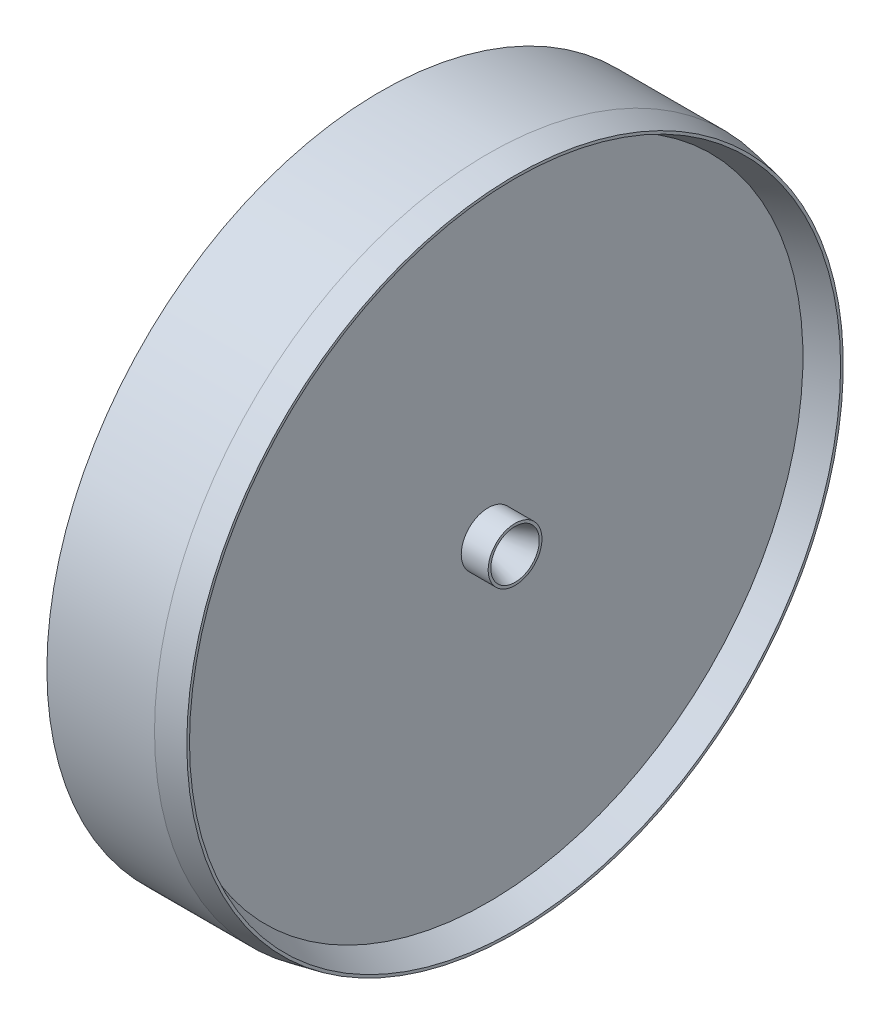
ISO-10303-21;
HEADER;
FILE_DESCRIPTION(('STEP AP214'),'2;1');
FILE_NAME('part.step','',(''),(''),'','','');
FILE_SCHEMA(('AUTOMOTIVE_DESIGN { 1 0 10303 214 1 1 1 1 }'));
ENDSEC;
DATA;
#1=APPLICATION_CONTEXT('core data for automotive mechanical design processes');
#2=APPLICATION_PROTOCOL_DEFINITION('international standard','automotive_design',2000,#1);
#3=PRODUCT_CONTEXT('',#1,'mechanical');
#4=PRODUCT('Part','Part','',(#3));
#5=PRODUCT_RELATED_PRODUCT_CATEGORY('part','',(#4));
#6=PRODUCT_DEFINITION_FORMATION('','',#4);
#7=PRODUCT_DEFINITION_CONTEXT('part definition',#1,'design');
#8=PRODUCT_DEFINITION('design','',#6,#7);
#9=PRODUCT_DEFINITION_SHAPE('','',#8);
#10=(LENGTH_UNIT() NAMED_UNIT(*) SI_UNIT(.MILLI.,.METRE.));
#11=(NAMED_UNIT(*) PLANE_ANGLE_UNIT() SI_UNIT($,.RADIAN.));
#12=(NAMED_UNIT(*) SI_UNIT($,.STERADIAN.) SOLID_ANGLE_UNIT());
#13=UNCERTAINTY_MEASURE_WITH_UNIT(LENGTH_MEASURE(1.E-05),#10,'distance_accuracy_value','');
#14=(GEOMETRIC_REPRESENTATION_CONTEXT(3) GLOBAL_UNCERTAINTY_ASSIGNED_CONTEXT((#13)) GLOBAL_UNIT_ASSIGNED_CONTEXT((#10,
#11,#12)) REPRESENTATION_CONTEXT('',''));
#15=CARTESIAN_POINT('',(0.,0.,0.));
#16=DIRECTION('',(0.,0.,1.));
#17=DIRECTION('',(1.,0.,0.));
#18=AXIS2_PLACEMENT_3D('',#15,#16,#17);
#19=CARTESIAN_POINT('',(3.99999999999999,0.,0.));
#20=DIRECTION('',(-1.,0.,0.));
#21=DIRECTION('',(0.,0.,1.));
#22=AXIS2_PLACEMENT_3D('',#19,#20,#21);
#23=PLANE('',#22);
#24=CARTESIAN_POINT('',(3.99999999999999,0.,0.));
#25=DIRECTION('',(-1.,0.,0.));
#26=DIRECTION('',(0.,0.,1.));
#27=AXIS2_PLACEMENT_3D('',#24,#25,#26);
#28=CIRCLE('',#27,0.5);
#29=CARTESIAN_POINT('',(3.99999999999999,0.,0.5));
#30=VERTEX_POINT('',#29);
#31=EDGE_CURVE('E10',#30,#30,#28,.T.);
#32=ORIENTED_EDGE('',*,*,#31,.F.);
#33=EDGE_LOOP('',(#32));
#34=FACE_BOUND('',#33,.T.);
#35=ADVANCED_FACE('F31',(#34),#23,.F.);
#36=CARTESIAN_POINT('',(3.99999999999999,0.,0.));
#37=DIRECTION('',(1.,0.,0.));
#38=DIRECTION('',(0.,0.,-1.));
#39=AXIS2_PLACEMENT_3D('',#36,#37,#38);
#40=CONICAL_SURFACE('',#39,0.5,0.380506377112365);
#41=CARTESIAN_POINT('',(4.99999999999999,0.,0.));
#42=DIRECTION('',(-1.,0.,0.));
#43=DIRECTION('',(0.,0.,1.));
#44=AXIS2_PLACEMENT_3D('',#41,#42,#43);
#45=CIRCLE('',#44,0.9);
#46=CARTESIAN_POINT('',(4.99999999999999,0.,0.9));
#47=VERTEX_POINT('',#46);
#48=EDGE_CURVE('E37',#47,#47,#45,.T.);
#49=ORIENTED_EDGE('',*,*,#48,.F.);
#50=EDGE_LOOP('',(#49));
#51=FACE_BOUND('',#50,.T.);
#52=ORIENTED_EDGE('',*,*,#31,.T.);
#53=EDGE_LOOP('',(#52));
#54=FACE_BOUND('',#53,.T.);
#55=ADVANCED_FACE('F106',(#51,#54),#40,.F.);
#56=CARTESIAN_POINT('',(4.99999999999999,0.9,0.));
#57=DIRECTION('',(-1.,0.,0.));
#58=DIRECTION('',(0.,0.,1.));
#59=AXIS2_PLACEMENT_3D('',#56,#57,#58);
#60=PLANE('',#59);
#61=CARTESIAN_POINT('',(4.99999999999999,0.,0.));
#62=DIRECTION('',(-1.,0.,0.));
#63=DIRECTION('',(0.,0.,1.));
#64=AXIS2_PLACEMENT_3D('',#61,#62,#63);
#65=CIRCLE('',#64,1.);
#66=CARTESIAN_POINT('',(4.99999999999999,0.,1.));
#67=VERTEX_POINT('',#66);
#68=EDGE_CURVE('E41',#67,#67,#65,.T.);
#69=ORIENTED_EDGE('',*,*,#68,.F.);
#70=EDGE_LOOP('',(#69));
#71=FACE_BOUND('',#70,.T.);
#72=ORIENTED_EDGE('',*,*,#48,.T.);
#73=EDGE_LOOP('',(#72));
#74=FACE_BOUND('',#73,.T.);
#75=ADVANCED_FACE('F101',(#71,#74),#60,.F.);
#76=CARTESIAN_POINT('',(0.,0.,0.));
#77=DIRECTION('',(-1.,0.,0.));
#78=DIRECTION('',(0.,0.,1.));
#79=AXIS2_PLACEMENT_3D('',#76,#77,#78);
#80=CYLINDRICAL_SURFACE('',#79,1.);
#81=CARTESIAN_POINT('',(3.99999999999999,0.,0.));
#82=DIRECTION('',(-1.,0.,0.));
#83=DIRECTION('',(0.,0.,1.));
#84=AXIS2_PLACEMENT_3D('',#81,#82,#83);
#85=CIRCLE('',#84,1.);
#86=CARTESIAN_POINT('',(3.99999999999999,0.,1.));
#87=VERTEX_POINT('',#86);
#88=EDGE_CURVE('E45',#87,#87,#85,.T.);
#89=ORIENTED_EDGE('',*,*,#88,.F.);
#90=EDGE_LOOP('',(#89));
#91=FACE_BOUND('',#90,.T.);
#92=ORIENTED_EDGE('',*,*,#68,.T.);
#93=EDGE_LOOP('',(#92));
#94=FACE_BOUND('',#93,.T.);
#95=ADVANCED_FACE('F95',(#91,#94),#80,.T.);
#96=CARTESIAN_POINT('',(3.99999999999999,1.,0.));
#97=DIRECTION('',(-1.,0.,0.));
#98=DIRECTION('',(0.,0.,1.));
#99=AXIS2_PLACEMENT_3D('',#96,#97,#98);
#100=PLANE('',#99);
#101=CARTESIAN_POINT('',(3.99999999999999,0.,0.));
#102=DIRECTION('',(-1.,0.,0.));
#103=DIRECTION('',(0.,0.,1.));
#104=AXIS2_PLACEMENT_3D('',#101,#102,#103);
#105=CIRCLE('',#104,11.7);
#106=CARTESIAN_POINT('',(3.99999999999999,0.,11.7));
#107=VERTEX_POINT('',#106);
#108=EDGE_CURVE('E50',#107,#107,#105,.T.);
#109=ORIENTED_EDGE('',*,*,#108,.F.);
#110=EDGE_LOOP('',(#109));
#111=FACE_BOUND('',#110,.T.);
#112=ORIENTED_EDGE('',*,*,#88,.T.);
#113=EDGE_LOOP('',(#112));
#114=FACE_BOUND('',#113,.T.);
#115=ADVANCED_FACE('F89',(#111,#114),#100,.F.);
#116=CARTESIAN_POINT('',(3.99999999999999,0.,0.));
#117=DIRECTION('',(1.,0.,0.));
#118=DIRECTION('',(0.,0.,-1.));
#119=AXIS2_PLACEMENT_3D('',#116,#117,#118);
#120=CONICAL_SURFACE('',#119,11.7,0.380506377112365);
#121=CARTESIAN_POINT('',(4.99999999999999,0.,0.));
#122=DIRECTION('',(-1.,0.,0.));
#123=DIRECTION('',(0.,0.,1.));
#124=AXIS2_PLACEMENT_3D('',#121,#122,#123);
#125=CIRCLE('',#124,12.1);
#126=CARTESIAN_POINT('',(4.99999999999999,0.,12.1));
#127=VERTEX_POINT('',#126);
#128=EDGE_CURVE('E53',#127,#127,#125,.T.);
#129=ORIENTED_EDGE('',*,*,#128,.F.);
#130=EDGE_LOOP('',(#129));
#131=FACE_BOUND('',#130,.T.);
#132=ORIENTED_EDGE('',*,*,#108,.T.);
#133=EDGE_LOOP('',(#132));
#134=FACE_BOUND('',#133,.T.);
#135=ADVANCED_FACE('F83',(#131,#134),#120,.F.);
#136=CARTESIAN_POINT('',(4.99999999999999,12.1,0.));
#137=DIRECTION('',(-1.,0.,0.));
#138=DIRECTION('',(0.,0.,1.));
#139=AXIS2_PLACEMENT_3D('',#136,#137,#138);
#140=PLANE('',#139);
#141=CARTESIAN_POINT('',(4.99999999999999,0.,0.));
#142=DIRECTION('',(-1.,0.,0.));
#143=DIRECTION('',(0.,0.,1.));
#144=AXIS2_PLACEMENT_3D('',#141,#142,#143);
#145=CIRCLE('',#144,12.2);
#146=CARTESIAN_POINT('',(4.99999999999999,0.,12.2));
#147=VERTEX_POINT('',#146);
#148=EDGE_CURVE('E56',#147,#147,#145,.T.);
#149=ORIENTED_EDGE('',*,*,#148,.F.);
#150=EDGE_LOOP('',(#149));
#151=FACE_BOUND('',#150,.T.);
#152=ORIENTED_EDGE('',*,*,#128,.T.);
#153=EDGE_LOOP('',(#152));
#154=FACE_BOUND('',#153,.T.);
#155=ADVANCED_FACE('F77',(#151,#154),#140,.F.);
#156=CARTESIAN_POINT('',(4.99999999999999,0.,0.));
#157=DIRECTION('',(-1.,0.,0.));
#158=DIRECTION('',(0.,0.,1.));
#159=AXIS2_PLACEMENT_3D('',#156,#157,#158);
#160=CONICAL_SURFACE('',#159,12.2,0.197395559849883);
#161=CARTESIAN_POINT('',(3.99999999999999,0.,0.));
#162=DIRECTION('',(-1.,0.,0.));
#163=DIRECTION('',(0.,0.,1.));
#164=AXIS2_PLACEMENT_3D('',#161,#162,#163);
#165=CIRCLE('',#164,12.4);
#166=CARTESIAN_POINT('',(3.99999999999999,0.,12.4));
#167=VERTEX_POINT('',#166);
#168=EDGE_CURVE('E59',#167,#167,#165,.T.);
#169=ORIENTED_EDGE('',*,*,#168,.F.);
#170=EDGE_LOOP('',(#169));
#171=FACE_BOUND('',#170,.T.);
#172=ORIENTED_EDGE('',*,*,#148,.T.);
#173=EDGE_LOOP('',(#172));
#174=FACE_BOUND('',#173,.T.);
#175=ADVANCED_FACE('F71',(#171,#174),#160,.T.);
#176=CARTESIAN_POINT('',(0.,0.,0.));
#177=DIRECTION('',(-1.,0.,0.));
#178=DIRECTION('',(0.,0.,1.));
#179=AXIS2_PLACEMENT_3D('',#176,#177,#178);
#180=CYLINDRICAL_SURFACE('',#179,12.4);
#181=CARTESIAN_POINT('',(0.,0.,0.));
#182=DIRECTION('',(-1.,0.,0.));
#183=DIRECTION('',(0.,0.,1.));
#184=AXIS2_PLACEMENT_3D('',#181,#182,#183);
#185=CIRCLE('',#184,12.4);
#186=CARTESIAN_POINT('',(0.,0.,12.4));
#187=VERTEX_POINT('',#186);
#188=EDGE_CURVE('E62',#187,#187,#185,.T.);
#189=ORIENTED_EDGE('',*,*,#188,.F.);
#190=EDGE_LOOP('',(#189));
#191=FACE_BOUND('',#190,.T.);
#192=ORIENTED_EDGE('',*,*,#168,.T.);
#193=EDGE_LOOP('',(#192));
#194=FACE_BOUND('',#193,.T.);
#195=ADVANCED_FACE('F68',(#191,#194),#180,.T.);
#196=CARTESIAN_POINT('',(0.,12.4,0.));
#197=DIRECTION('',(1.,0.,0.));
#198=DIRECTION('',(0.,0.,-1.));
#199=AXIS2_PLACEMENT_3D('',#196,#197,#198);
#200=PLANE('',#199);
#201=ORIENTED_EDGE('',*,*,#188,.T.);
#202=EDGE_LOOP('',(#201));
#203=FACE_BOUND('',#202,.T.);
#204=ADVANCED_FACE('F66',(#203),#200,.F.);
#205=CLOSED_SHELL('',(#35,#55,#75,#95,#115,#135,#155,#175,#195,#204));
#206=MANIFOLD_SOLID_BREP('B2',#205);
#207=ADVANCED_BREP_SHAPE_REPRESENTATION('',(#18,#206),#14);
#208=SHAPE_DEFINITION_REPRESENTATION(#9,#207);
ENDSEC;
END-ISO-10303-21;
